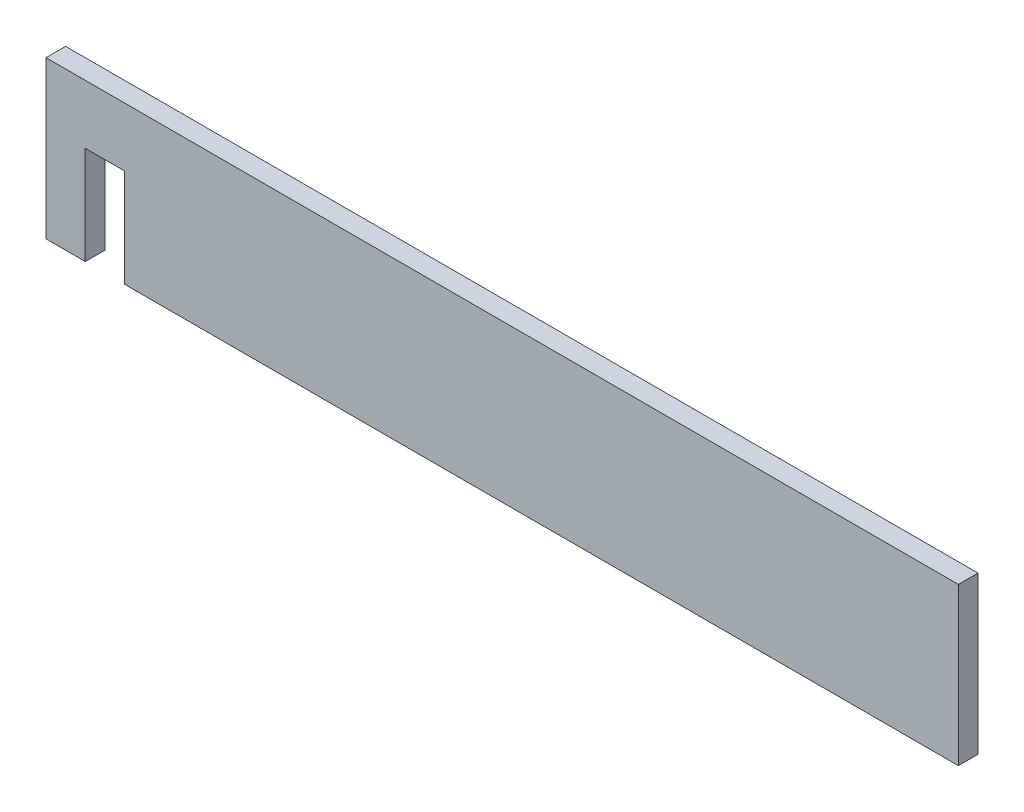
ISO-10303-21;
HEADER;
FILE_DESCRIPTION(('STEP AP214'),'2;1');
FILE_NAME('part.step','',(''),(''),'','','');
FILE_SCHEMA(('AUTOMOTIVE_DESIGN { 1 0 10303 214 1 1 1 1 }'));
ENDSEC;
DATA;
#1=APPLICATION_CONTEXT('core data for automotive mechanical design processes');
#2=APPLICATION_PROTOCOL_DEFINITION('international standard','automotive_design',2000,#1);
#3=PRODUCT_CONTEXT('',#1,'mechanical');
#4=PRODUCT('Part','Part','',(#3));
#5=PRODUCT_RELATED_PRODUCT_CATEGORY('part','',(#4));
#6=PRODUCT_DEFINITION_FORMATION('','',#4);
#7=PRODUCT_DEFINITION_CONTEXT('part definition',#1,'design');
#8=PRODUCT_DEFINITION('design','',#6,#7);
#9=PRODUCT_DEFINITION_SHAPE('','',#8);
#10=(LENGTH_UNIT() NAMED_UNIT(*) SI_UNIT(.MILLI.,.METRE.));
#11=(NAMED_UNIT(*) PLANE_ANGLE_UNIT() SI_UNIT($,.RADIAN.));
#12=(NAMED_UNIT(*) SI_UNIT($,.STERADIAN.) SOLID_ANGLE_UNIT());
#13=UNCERTAINTY_MEASURE_WITH_UNIT(LENGTH_MEASURE(1.E-05),#10,'distance_accuracy_value','');
#14=(GEOMETRIC_REPRESENTATION_CONTEXT(3) GLOBAL_UNCERTAINTY_ASSIGNED_CONTEXT((#13)) GLOBAL_UNIT_ASSIGNED_CONTEXT((#10,
#11,#12)) REPRESENTATION_CONTEXT('',''));
#15=CARTESIAN_POINT('',(0.,0.,0.));
#16=DIRECTION('',(0.,0.,1.));
#17=DIRECTION('',(1.,0.,0.));
#18=AXIS2_PLACEMENT_3D('',#15,#16,#17);
#19=CARTESIAN_POINT('',(0.,0.,2.54));
#20=DIRECTION('',(1.,0.,0.));
#21=DIRECTION('',(0.,0.,-1.));
#22=AXIS2_PLACEMENT_3D('',#19,#20,#21);
#23=PLANE('',#22);
#24=DIRECTION('',(0.,-1.,0.));
#25=VECTOR('',#24,1.);
#26=CARTESIAN_POINT('',(0.,0.,0.));
#27=LINE('',#26,#25);
#28=CARTESIAN_POINT('',(0.,20.32,0.));
#29=VERTEX_POINT('',#28);
#30=CARTESIAN_POINT('',(0.,0.,0.));
#31=VERTEX_POINT('',#30);
#32=EDGE_CURVE('E129',#29,#31,#27,.T.);
#33=ORIENTED_EDGE('',*,*,#32,.T.);
#34=DIRECTION('',(0.,0.,-1.));
#35=VECTOR('',#34,1.);
#36=CARTESIAN_POINT('',(0.,0.,2.54));
#37=LINE('',#36,#35);
#38=CARTESIAN_POINT('',(0.,0.,2.54));
#39=VERTEX_POINT('',#38);
#40=EDGE_CURVE('E11',#39,#31,#37,.T.);
#41=ORIENTED_EDGE('',*,*,#40,.F.);
#42=DIRECTION('',(0.,-1.,0.));
#43=VECTOR('',#42,1.);
#44=CARTESIAN_POINT('',(0.,0.,2.54));
#45=LINE('',#44,#43);
#46=CARTESIAN_POINT('',(0.,20.32,2.54));
#47=VERTEX_POINT('',#46);
#48=EDGE_CURVE('E143',#47,#39,#45,.T.);
#49=ORIENTED_EDGE('',*,*,#48,.F.);
#50=DIRECTION('',(0.,0.,-1.));
#51=VECTOR('',#50,1.);
#52=CARTESIAN_POINT('',(0.,20.32,2.54));
#53=LINE('',#52,#51);
#54=EDGE_CURVE('E125',#47,#29,#53,.T.);
#55=ORIENTED_EDGE('',*,*,#54,.T.);
#56=EDGE_LOOP('',(#33,#41,#49,#55));
#57=FACE_BOUND('',#56,.T.);
#58=ADVANCED_FACE('F33',(#57),#23,.F.);
#59=CARTESIAN_POINT('',(0.,0.,2.54));
#60=DIRECTION('',(0.,1.,0.));
#61=DIRECTION('',(0.,0.,1.));
#62=AXIS2_PLACEMENT_3D('',#59,#60,#61);
#63=PLANE('',#62);
#64=DIRECTION('',(1.,0.,0.));
#65=VECTOR('',#64,1.);
#66=CARTESIAN_POINT('',(0.,0.,0.));
#67=LINE('',#66,#65);
#68=CARTESIAN_POINT('',(5.08,0.,0.));
#69=VERTEX_POINT('',#68);
#70=EDGE_CURVE('E132',#31,#69,#67,.T.);
#71=ORIENTED_EDGE('',*,*,#70,.T.);
#72=DIRECTION('',(0.,0.,-1.));
#73=VECTOR('',#72,1.);
#74=CARTESIAN_POINT('',(5.08,0.,2.54));
#75=LINE('',#74,#73);
#76=CARTESIAN_POINT('',(5.08,0.,2.54));
#77=VERTEX_POINT('',#76);
#78=EDGE_CURVE('E41',#77,#69,#75,.T.);
#79=ORIENTED_EDGE('',*,*,#78,.F.);
#80=DIRECTION('',(1.,0.,0.));
#81=VECTOR('',#80,1.);
#82=CARTESIAN_POINT('',(0.,0.,2.54));
#83=LINE('',#82,#81);
#84=EDGE_CURVE('E92',#39,#77,#83,.T.);
#85=ORIENTED_EDGE('',*,*,#84,.F.);
#86=ORIENTED_EDGE('',*,*,#40,.T.);
#87=EDGE_LOOP('',(#71,#79,#85,#86));
#88=FACE_BOUND('',#87,.T.);
#89=ADVANCED_FACE('F178',(#88),#63,.F.);
#90=CARTESIAN_POINT('',(5.08,0.,2.54));
#91=DIRECTION('',(-1.,0.,0.));
#92=DIRECTION('',(0.,0.,1.));
#93=AXIS2_PLACEMENT_3D('',#90,#91,#92);
#94=PLANE('',#93);
#95=DIRECTION('',(0.,1.,0.));
#96=VECTOR('',#95,1.);
#97=CARTESIAN_POINT('',(5.08,0.,0.));
#98=LINE('',#97,#96);
#99=CARTESIAN_POINT('',(5.08,12.7,0.));
#100=VERTEX_POINT('',#99);
#101=EDGE_CURVE('E134',#69,#100,#98,.T.);
#102=ORIENTED_EDGE('',*,*,#101,.T.);
#103=DIRECTION('',(0.,0.,-1.));
#104=VECTOR('',#103,1.);
#105=CARTESIAN_POINT('',(5.08,12.7,2.54));
#106=LINE('',#105,#104);
#107=CARTESIAN_POINT('',(5.08,12.7,2.54));
#108=VERTEX_POINT('',#107);
#109=EDGE_CURVE('E150',#108,#100,#106,.T.);
#110=ORIENTED_EDGE('',*,*,#109,.F.);
#111=DIRECTION('',(0.,1.,0.));
#112=VECTOR('',#111,1.);
#113=CARTESIAN_POINT('',(5.08,0.,2.54));
#114=LINE('',#113,#112);
#115=EDGE_CURVE('E158',#77,#108,#114,.T.);
#116=ORIENTED_EDGE('',*,*,#115,.F.);
#117=ORIENTED_EDGE('',*,*,#78,.T.);
#118=EDGE_LOOP('',(#102,#110,#116,#117));
#119=FACE_BOUND('',#118,.T.);
#120=ADVANCED_FACE('F156',(#119),#94,.F.);
#121=CARTESIAN_POINT('',(5.08,12.7,2.54));
#122=DIRECTION('',(0.,1.,0.));
#123=DIRECTION('',(-1.,0.,0.));
#124=AXIS2_PLACEMENT_3D('',#121,#122,#123);
#125=PLANE('',#124);
#126=DIRECTION('',(1.,0.,0.));
#127=VECTOR('',#126,1.);
#128=CARTESIAN_POINT('',(5.08,12.7,0.));
#129=LINE('',#128,#127);
#130=CARTESIAN_POINT('',(10.16,12.7,0.));
#131=VERTEX_POINT('',#130);
#132=EDGE_CURVE('E136',#100,#131,#129,.T.);
#133=ORIENTED_EDGE('',*,*,#132,.T.);
#134=DIRECTION('',(0.,0.,-1.));
#135=VECTOR('',#134,1.);
#136=CARTESIAN_POINT('',(10.16,12.7,2.54));
#137=LINE('',#136,#135);
#138=CARTESIAN_POINT('',(10.16,12.7,2.54));
#139=VERTEX_POINT('',#138);
#140=EDGE_CURVE('E147',#139,#131,#137,.T.);
#141=ORIENTED_EDGE('',*,*,#140,.F.);
#142=DIRECTION('',(1.,0.,0.));
#143=VECTOR('',#142,1.);
#144=CARTESIAN_POINT('',(5.08,12.7,2.54));
#145=LINE('',#144,#143);
#146=EDGE_CURVE('E170',#108,#139,#145,.T.);
#147=ORIENTED_EDGE('',*,*,#146,.F.);
#148=ORIENTED_EDGE('',*,*,#109,.T.);
#149=EDGE_LOOP('',(#133,#141,#147,#148));
#150=FACE_BOUND('',#149,.T.);
#151=ADVANCED_FACE('F166',(#150),#125,.F.);
#152=CARTESIAN_POINT('',(10.16,0.,2.54));
#153=DIRECTION('',(1.,0.,0.));
#154=DIRECTION('',(0.,1.,0.));
#155=AXIS2_PLACEMENT_3D('',#152,#153,#154);
#156=PLANE('',#155);
#157=DIRECTION('',(0.,-1.,0.));
#158=VECTOR('',#157,1.);
#159=CARTESIAN_POINT('',(10.16,0.,0.));
#160=LINE('',#159,#158);
#161=CARTESIAN_POINT('',(10.16,0.,0.));
#162=VERTEX_POINT('',#161);
#163=EDGE_CURVE('E138',#131,#162,#160,.T.);
#164=ORIENTED_EDGE('',*,*,#163,.T.);
#165=DIRECTION('',(0.,0.,-1.));
#166=VECTOR('',#165,1.);
#167=CARTESIAN_POINT('',(10.16,0.,2.54));
#168=LINE('',#167,#166);
#169=CARTESIAN_POINT('',(10.16,0.,2.54));
#170=VERTEX_POINT('',#169);
#171=EDGE_CURVE('E120',#170,#162,#168,.T.);
#172=ORIENTED_EDGE('',*,*,#171,.F.);
#173=DIRECTION('',(0.,-1.,0.));
#174=VECTOR('',#173,1.);
#175=CARTESIAN_POINT('',(10.16,0.,2.54));
#176=LINE('',#175,#174);
#177=EDGE_CURVE('E111',#139,#170,#176,.T.);
#178=ORIENTED_EDGE('',*,*,#177,.F.);
#179=ORIENTED_EDGE('',*,*,#140,.T.);
#180=EDGE_LOOP('',(#164,#172,#178,#179));
#181=FACE_BOUND('',#180,.T.);
#182=ADVANCED_FACE('F169',(#181),#156,.F.);
#183=CARTESIAN_POINT('',(10.16,0.,2.54));
#184=DIRECTION('',(0.,1.,0.));
#185=DIRECTION('',(0.,0.,1.));
#186=AXIS2_PLACEMENT_3D('',#183,#184,#185);
#187=PLANE('',#186);
#188=DIRECTION('',(1.,0.,0.));
#189=VECTOR('',#188,1.);
#190=CARTESIAN_POINT('',(10.16,0.,0.));
#191=LINE('',#190,#189);
#192=CARTESIAN_POINT('',(118.11,0.,0.));
#193=VERTEX_POINT('',#192);
#194=EDGE_CURVE('E119',#162,#193,#191,.T.);
#195=ORIENTED_EDGE('',*,*,#194,.T.);
#196=DIRECTION('',(0.,0.,-1.));
#197=VECTOR('',#196,1.);
#198=CARTESIAN_POINT('',(118.11,0.,2.54));
#199=LINE('',#198,#197);
#200=CARTESIAN_POINT('',(118.11,0.,2.54));
#201=VERTEX_POINT('',#200);
#202=EDGE_CURVE('E116',#201,#193,#199,.T.);
#203=ORIENTED_EDGE('',*,*,#202,.F.);
#204=DIRECTION('',(1.,0.,0.));
#205=VECTOR('',#204,1.);
#206=CARTESIAN_POINT('',(10.16,0.,2.54));
#207=LINE('',#206,#205);
#208=EDGE_CURVE('E105',#170,#201,#207,.T.);
#209=ORIENTED_EDGE('',*,*,#208,.F.);
#210=ORIENTED_EDGE('',*,*,#171,.T.);
#211=EDGE_LOOP('',(#195,#203,#209,#210));
#212=FACE_BOUND('',#211,.T.);
#213=ADVANCED_FACE('F117',(#212),#187,.F.);
#214=CARTESIAN_POINT('',(118.11,0.,2.54));
#215=DIRECTION('',(-1.,0.,0.));
#216=DIRECTION('',(0.,-1.,0.));
#217=AXIS2_PLACEMENT_3D('',#214,#215,#216);
#218=PLANE('',#217);
#219=DIRECTION('',(0.,1.,0.));
#220=VECTOR('',#219,1.);
#221=CARTESIAN_POINT('',(118.11,0.,0.));
#222=LINE('',#221,#220);
#223=CARTESIAN_POINT('',(118.11,20.32,0.));
#224=VERTEX_POINT('',#223);
#225=EDGE_CURVE('E78',#193,#224,#222,.T.);
#226=ORIENTED_EDGE('',*,*,#225,.T.);
#227=DIRECTION('',(0.,0.,-1.));
#228=VECTOR('',#227,1.);
#229=CARTESIAN_POINT('',(118.11,20.32,2.54));
#230=LINE('',#229,#228);
#231=CARTESIAN_POINT('',(118.11,20.32,2.54));
#232=VERTEX_POINT('',#231);
#233=EDGE_CURVE('E121',#232,#224,#230,.T.);
#234=ORIENTED_EDGE('',*,*,#233,.F.);
#235=DIRECTION('',(0.,1.,0.));
#236=VECTOR('',#235,1.);
#237=CARTESIAN_POINT('',(118.11,0.,2.54));
#238=LINE('',#237,#236);
#239=EDGE_CURVE('E109',#201,#232,#238,.T.);
#240=ORIENTED_EDGE('',*,*,#239,.F.);
#241=ORIENTED_EDGE('',*,*,#202,.T.);
#242=EDGE_LOOP('',(#226,#234,#240,#241));
#243=FACE_BOUND('',#242,.T.);
#244=ADVANCED_FACE('F123',(#243),#218,.F.);
#245=CARTESIAN_POINT('',(0.,20.32,2.54));
#246=DIRECTION('',(0.,-1.,0.));
#247=DIRECTION('',(0.,0.,-1.));
#248=AXIS2_PLACEMENT_3D('',#245,#246,#247);
#249=PLANE('',#248);
#250=DIRECTION('',(-1.,0.,0.));
#251=VECTOR('',#250,1.);
#252=CARTESIAN_POINT('',(0.,20.32,0.));
#253=LINE('',#252,#251);
#254=EDGE_CURVE('E84',#224,#29,#253,.T.);
#255=ORIENTED_EDGE('',*,*,#254,.T.);
#256=ORIENTED_EDGE('',*,*,#54,.F.);
#257=DIRECTION('',(-1.,0.,0.));
#258=VECTOR('',#257,1.);
#259=CARTESIAN_POINT('',(0.,20.32,2.54));
#260=LINE('',#259,#258);
#261=EDGE_CURVE('E49',#232,#47,#260,.T.);
#262=ORIENTED_EDGE('',*,*,#261,.F.);
#263=ORIENTED_EDGE('',*,*,#233,.T.);
#264=EDGE_LOOP('',(#255,#256,#262,#263));
#265=FACE_BOUND('',#264,.T.);
#266=ADVANCED_FACE('F194',(#265),#249,.F.);
#267=CARTESIAN_POINT('',(0.,0.,2.54));
#268=DIRECTION('',(0.,0.,-1.));
#269=DIRECTION('',(-1.,0.,0.));
#270=AXIS2_PLACEMENT_3D('',#267,#268,#269);
#271=PLANE('',#270);
#272=ORIENTED_EDGE('',*,*,#48,.T.);
#273=ORIENTED_EDGE('',*,*,#84,.T.);
#274=ORIENTED_EDGE('',*,*,#115,.T.);
#275=ORIENTED_EDGE('',*,*,#146,.T.);
#276=ORIENTED_EDGE('',*,*,#177,.T.);
#277=ORIENTED_EDGE('',*,*,#208,.T.);
#278=ORIENTED_EDGE('',*,*,#239,.T.);
#279=ORIENTED_EDGE('',*,*,#261,.T.);
#280=EDGE_LOOP('',(#272,#273,#274,#275,#276,#277,#278,#279));
#281=FACE_BOUND('',#280,.T.);
#282=ADVANCED_FACE('F107',(#281),#271,.F.);
#283=CARTESIAN_POINT('',(0.,0.,0.));
#284=DIRECTION('',(0.,0.,-1.));
#285=DIRECTION('',(-1.,0.,0.));
#286=AXIS2_PLACEMENT_3D('',#283,#284,#285);
#287=PLANE('',#286);
#288=ORIENTED_EDGE('',*,*,#32,.F.);
#289=ORIENTED_EDGE('',*,*,#254,.F.);
#290=ORIENTED_EDGE('',*,*,#225,.F.);
#291=ORIENTED_EDGE('',*,*,#194,.F.);
#292=ORIENTED_EDGE('',*,*,#163,.F.);
#293=ORIENTED_EDGE('',*,*,#132,.F.);
#294=ORIENTED_EDGE('',*,*,#101,.F.);
#295=ORIENTED_EDGE('',*,*,#70,.F.);
#296=EDGE_LOOP('',(#288,#289,#290,#291,#292,#293,#294,#295));
#297=FACE_BOUND('',#296,.T.);
#298=ADVANCED_FACE('F162',(#297),#287,.T.);
#299=CLOSED_SHELL('',(#58,#89,#120,#151,#182,#213,#244,#266,#282,#298));
#300=MANIFOLD_SOLID_BREP('B2',#299);
#301=ADVANCED_BREP_SHAPE_REPRESENTATION('',(#18,#300),#14);
#302=SHAPE_DEFINITION_REPRESENTATION(#9,#301);
ENDSEC;
END-ISO-10303-21;
